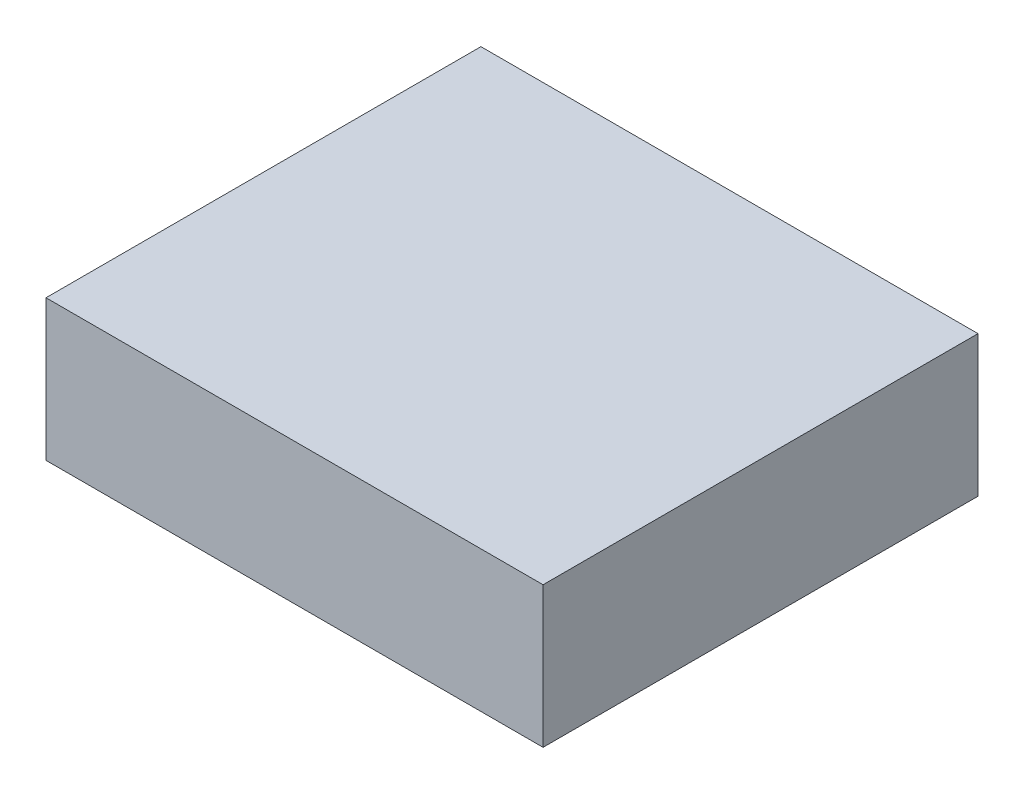
ISO-10303-21;
HEADER;
FILE_DESCRIPTION(('STEP AP214'),'2;1');
FILE_NAME('part.step','',(''),(''),'','','');
FILE_SCHEMA(('AUTOMOTIVE_DESIGN { 1 0 10303 214 1 1 1 1 }'));
ENDSEC;
DATA;
#1=APPLICATION_CONTEXT('core data for automotive mechanical design processes');
#2=APPLICATION_PROTOCOL_DEFINITION('international standard','automotive_design',2000,#1);
#3=PRODUCT_CONTEXT('',#1,'mechanical');
#4=PRODUCT('Part','Part','',(#3));
#5=PRODUCT_RELATED_PRODUCT_CATEGORY('part','',(#4));
#6=PRODUCT_DEFINITION_FORMATION('','',#4);
#7=PRODUCT_DEFINITION_CONTEXT('part definition',#1,'design');
#8=PRODUCT_DEFINITION('design','',#6,#7);
#9=PRODUCT_DEFINITION_SHAPE('','',#8);
#10=(LENGTH_UNIT() NAMED_UNIT(*) SI_UNIT(.MILLI.,.METRE.));
#11=(NAMED_UNIT(*) PLANE_ANGLE_UNIT() SI_UNIT($,.RADIAN.));
#12=(NAMED_UNIT(*) SI_UNIT($,.STERADIAN.) SOLID_ANGLE_UNIT());
#13=UNCERTAINTY_MEASURE_WITH_UNIT(LENGTH_MEASURE(1.E-05),#10,'distance_accuracy_value','');
#14=(GEOMETRIC_REPRESENTATION_CONTEXT(3) GLOBAL_UNCERTAINTY_ASSIGNED_CONTEXT((#13)) GLOBAL_UNIT_ASSIGNED_CONTEXT((#10,
#11,#12)) REPRESENTATION_CONTEXT('',''));
#15=CARTESIAN_POINT('',(0.,0.,0.));
#16=DIRECTION('',(0.,0.,1.));
#17=DIRECTION('',(1.,0.,0.));
#18=AXIS2_PLACEMENT_3D('',#15,#16,#17);
#19=CARTESIAN_POINT('',(24.,13.6,-21.));
#20=DIRECTION('',(-1.,0.,0.));
#21=DIRECTION('',(0.,0.,1.));
#22=AXIS2_PLACEMENT_3D('',#19,#20,#21);
#23=PLANE('',#22);
#24=DIRECTION('',(0.,0.,-1.));
#25=VECTOR('',#24,1.);
#26=CARTESIAN_POINT('',(24.,0.,-21.));
#27=LINE('',#26,#25);
#28=CARTESIAN_POINT('',(24.,0.,21.));
#29=VERTEX_POINT('',#28);
#30=CARTESIAN_POINT('',(24.,0.,-21.));
#31=VERTEX_POINT('',#30);
#32=EDGE_CURVE('E100',#29,#31,#27,.T.);
#33=ORIENTED_EDGE('',*,*,#32,.T.);
#34=DIRECTION('',(0.,-1.,0.));
#35=VECTOR('',#34,1.);
#36=CARTESIAN_POINT('',(24.,13.6,-21.));
#37=LINE('',#36,#35);
#38=CARTESIAN_POINT('',(24.,13.6,-21.));
#39=VERTEX_POINT('',#38);
#40=EDGE_CURVE('E11',#39,#31,#37,.T.);
#41=ORIENTED_EDGE('',*,*,#40,.F.);
#42=DIRECTION('',(0.,0.,-1.));
#43=VECTOR('',#42,1.);
#44=CARTESIAN_POINT('',(24.,13.6,-21.));
#45=LINE('',#44,#43);
#46=CARTESIAN_POINT('',(24.,13.6,21.));
#47=VERTEX_POINT('',#46);
#48=EDGE_CURVE('E88',#47,#39,#45,.T.);
#49=ORIENTED_EDGE('',*,*,#48,.F.);
#50=DIRECTION('',(0.,-1.,0.));
#51=VECTOR('',#50,1.);
#52=CARTESIAN_POINT('',(24.,13.6,21.));
#53=LINE('',#52,#51);
#54=EDGE_CURVE('E96',#47,#29,#53,.T.);
#55=ORIENTED_EDGE('',*,*,#54,.T.);
#56=EDGE_LOOP('',(#33,#41,#49,#55));
#57=FACE_BOUND('',#56,.T.);
#58=ADVANCED_FACE('F37',(#57),#23,.F.);
#59=CARTESIAN_POINT('',(-24.,13.6,-21.));
#60=DIRECTION('',(0.,0.,1.));
#61=DIRECTION('',(1.,0.,0.));
#62=AXIS2_PLACEMENT_3D('',#59,#60,#61);
#63=PLANE('',#62);
#64=DIRECTION('',(-1.,0.,0.));
#65=VECTOR('',#64,1.);
#66=CARTESIAN_POINT('',(-24.,0.,-21.));
#67=LINE('',#66,#65);
#68=CARTESIAN_POINT('',(-24.,0.,-21.));
#69=VERTEX_POINT('',#68);
#70=EDGE_CURVE('E92',#31,#69,#67,.T.);
#71=ORIENTED_EDGE('',*,*,#70,.T.);
#72=DIRECTION('',(0.,-1.,0.));
#73=VECTOR('',#72,1.);
#74=CARTESIAN_POINT('',(-24.,13.6,-21.));
#75=LINE('',#74,#73);
#76=CARTESIAN_POINT('',(-24.,13.6,-21.));
#77=VERTEX_POINT('',#76);
#78=EDGE_CURVE('E45',#77,#69,#75,.T.);
#79=ORIENTED_EDGE('',*,*,#78,.F.);
#80=DIRECTION('',(-1.,0.,0.));
#81=VECTOR('',#80,1.);
#82=CARTESIAN_POINT('',(-24.,13.6,-21.));
#83=LINE('',#82,#81);
#84=EDGE_CURVE('E83',#39,#77,#83,.T.);
#85=ORIENTED_EDGE('',*,*,#84,.F.);
#86=ORIENTED_EDGE('',*,*,#40,.T.);
#87=EDGE_LOOP('',(#71,#79,#85,#86));
#88=FACE_BOUND('',#87,.T.);
#89=ADVANCED_FACE('F91',(#88),#63,.F.);
#90=CARTESIAN_POINT('',(-24.,13.6,-21.));
#91=DIRECTION('',(1.,0.,0.));
#92=DIRECTION('',(0.,0.,-1.));
#93=AXIS2_PLACEMENT_3D('',#90,#91,#92);
#94=PLANE('',#93);
#95=DIRECTION('',(0.,0.,1.));
#96=VECTOR('',#95,1.);
#97=CARTESIAN_POINT('',(-24.,0.,-21.));
#98=LINE('',#97,#96);
#99=CARTESIAN_POINT('',(-24.,0.,21.));
#100=VERTEX_POINT('',#99);
#101=EDGE_CURVE('E70',#69,#100,#98,.T.);
#102=ORIENTED_EDGE('',*,*,#101,.T.);
#103=DIRECTION('',(0.,-1.,0.));
#104=VECTOR('',#103,1.);
#105=CARTESIAN_POINT('',(-24.,13.6,21.));
#106=LINE('',#105,#104);
#107=CARTESIAN_POINT('',(-24.,13.6,21.));
#108=VERTEX_POINT('',#107);
#109=EDGE_CURVE('E93',#108,#100,#106,.T.);
#110=ORIENTED_EDGE('',*,*,#109,.F.);
#111=DIRECTION('',(0.,0.,1.));
#112=VECTOR('',#111,1.);
#113=CARTESIAN_POINT('',(-24.,13.6,-21.));
#114=LINE('',#113,#112);
#115=EDGE_CURVE('E86',#77,#108,#114,.T.);
#116=ORIENTED_EDGE('',*,*,#115,.F.);
#117=ORIENTED_EDGE('',*,*,#78,.T.);
#118=EDGE_LOOP('',(#102,#110,#116,#117));
#119=FACE_BOUND('',#118,.T.);
#120=ADVANCED_FACE('F94',(#119),#94,.F.);
#121=CARTESIAN_POINT('',(-24.,13.6,21.));
#122=DIRECTION('',(0.,0.,-1.));
#123=DIRECTION('',(-1.,0.,0.));
#124=AXIS2_PLACEMENT_3D('',#121,#122,#123);
#125=PLANE('',#124);
#126=DIRECTION('',(1.,0.,0.));
#127=VECTOR('',#126,1.);
#128=CARTESIAN_POINT('',(-24.,0.,21.));
#129=LINE('',#128,#127);
#130=EDGE_CURVE('E76',#100,#29,#129,.T.);
#131=ORIENTED_EDGE('',*,*,#130,.T.);
#132=ORIENTED_EDGE('',*,*,#54,.F.);
#133=DIRECTION('',(1.,0.,0.));
#134=VECTOR('',#133,1.);
#135=CARTESIAN_POINT('',(-24.,13.6,21.));
#136=LINE('',#135,#134);
#137=EDGE_CURVE('E53',#108,#47,#136,.T.);
#138=ORIENTED_EDGE('',*,*,#137,.F.);
#139=ORIENTED_EDGE('',*,*,#109,.T.);
#140=EDGE_LOOP('',(#131,#132,#138,#139));
#141=FACE_BOUND('',#140,.T.);
#142=ADVANCED_FACE('F107',(#141),#125,.F.);
#143=CARTESIAN_POINT('',(0.,13.6,0.));
#144=DIRECTION('',(0.,1.,0.));
#145=DIRECTION('',(0.,0.,1.));
#146=AXIS2_PLACEMENT_3D('',#143,#144,#145);
#147=PLANE('',#146);
#148=ORIENTED_EDGE('',*,*,#48,.T.);
#149=ORIENTED_EDGE('',*,*,#84,.T.);
#150=ORIENTED_EDGE('',*,*,#115,.T.);
#151=ORIENTED_EDGE('',*,*,#137,.T.);
#152=EDGE_LOOP('',(#148,#149,#150,#151));
#153=FACE_BOUND('',#152,.T.);
#154=ADVANCED_FACE('F84',(#153),#147,.T.);
#155=CARTESIAN_POINT('',(0.,0.,0.));
#156=DIRECTION('',(0.,1.,0.));
#157=DIRECTION('',(0.,0.,1.));
#158=AXIS2_PLACEMENT_3D('',#155,#156,#157);
#159=PLANE('',#158);
#160=ORIENTED_EDGE('',*,*,#32,.F.);
#161=ORIENTED_EDGE('',*,*,#130,.F.);
#162=ORIENTED_EDGE('',*,*,#101,.F.);
#163=ORIENTED_EDGE('',*,*,#70,.F.);
#164=EDGE_LOOP('',(#160,#161,#162,#163));
#165=FACE_BOUND('',#164,.T.);
#166=ADVANCED_FACE('F110',(#165),#159,.F.);
#167=CLOSED_SHELL('',(#58,#89,#120,#142,#154,#166));
#168=MANIFOLD_SOLID_BREP('B2',#167);
#169=ADVANCED_BREP_SHAPE_REPRESENTATION('',(#18,#168),#14);
#170=SHAPE_DEFINITION_REPRESENTATION(#9,#169);
ENDSEC;
END-ISO-10303-21;
